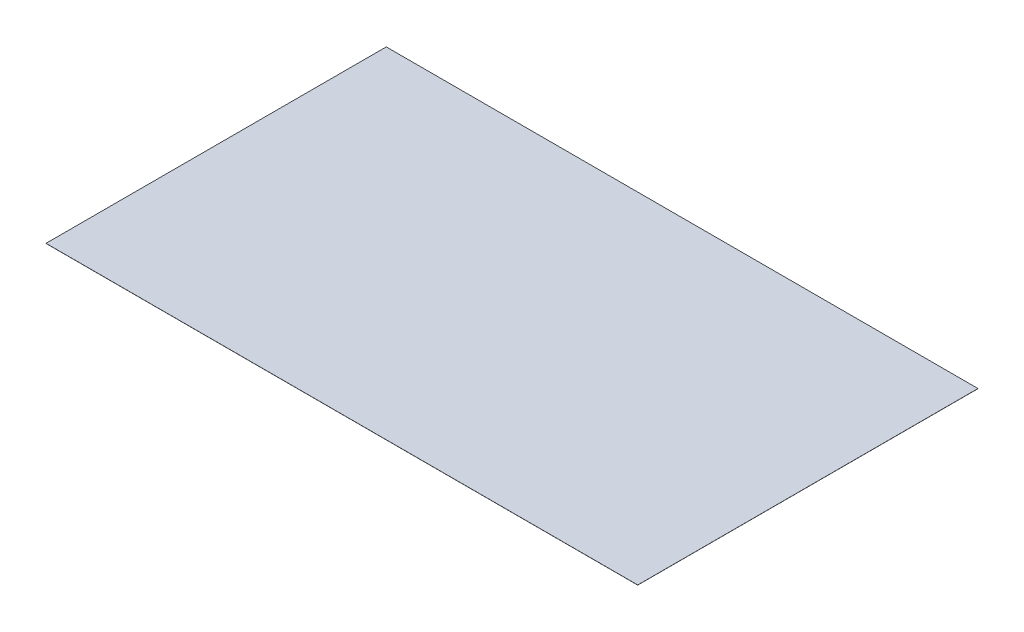
ISO-10303-21;
HEADER;
FILE_DESCRIPTION(('STEP AP214'),'2;1');
FILE_NAME('part.step','',(''),(''),'','','');
FILE_SCHEMA(('AUTOMOTIVE_DESIGN { 1 0 10303 214 1 1 1 1 }'));
ENDSEC;
DATA;
#1=APPLICATION_CONTEXT('core data for automotive mechanical design processes');
#2=APPLICATION_PROTOCOL_DEFINITION('international standard','automotive_design',2000,#1);
#3=PRODUCT_CONTEXT('',#1,'mechanical');
#4=PRODUCT('Part','Part','',(#3));
#5=PRODUCT_RELATED_PRODUCT_CATEGORY('part','',(#4));
#6=PRODUCT_DEFINITION_FORMATION('','',#4);
#7=PRODUCT_DEFINITION_CONTEXT('part definition',#1,'design');
#8=PRODUCT_DEFINITION('design','',#6,#7);
#9=PRODUCT_DEFINITION_SHAPE('','',#8);
#10=(LENGTH_UNIT() NAMED_UNIT(*) SI_UNIT(.MILLI.,.METRE.));
#11=(NAMED_UNIT(*) PLANE_ANGLE_UNIT() SI_UNIT($,.RADIAN.));
#12=(NAMED_UNIT(*) SI_UNIT($,.STERADIAN.) SOLID_ANGLE_UNIT());
#13=UNCERTAINTY_MEASURE_WITH_UNIT(LENGTH_MEASURE(1.E-05),#10,'distance_accuracy_value','');
#14=(GEOMETRIC_REPRESENTATION_CONTEXT(3) GLOBAL_UNCERTAINTY_ASSIGNED_CONTEXT((#13)) GLOBAL_UNIT_ASSIGNED_CONTEXT((#10,
#11,#12)) REPRESENTATION_CONTEXT('',''));
#15=CARTESIAN_POINT('',(0.,0.,0.));
#16=DIRECTION('',(0.,0.,1.));
#17=DIRECTION('',(1.,0.,0.));
#18=AXIS2_PLACEMENT_3D('',#15,#16,#17);
#19=CARTESIAN_POINT('',(-6096.,2.54,3505.2));
#20=DIRECTION('',(1.,0.,0.));
#21=DIRECTION('',(0.,0.,-1.));
#22=AXIS2_PLACEMENT_3D('',#19,#20,#21);
#23=PLANE('',#22);
#24=DIRECTION('',(0.,0.,1.));
#25=VECTOR('',#24,1.);
#26=CARTESIAN_POINT('',(-6096.,0.,3505.2));
#27=LINE('',#26,#25);
#28=CARTESIAN_POINT('',(-6096.,0.,-3505.2));
#29=VERTEX_POINT('',#28);
#30=CARTESIAN_POINT('',(-6096.,0.,3505.2));
#31=VERTEX_POINT('',#30);
#32=EDGE_CURVE('E96',#29,#31,#27,.T.);
#33=ORIENTED_EDGE('',*,*,#32,.T.);
#34=DIRECTION('',(0.,-1.,0.));
#35=VECTOR('',#34,1.);
#36=CARTESIAN_POINT('',(-6096.,2.54,3505.2));
#37=LINE('',#36,#35);
#38=CARTESIAN_POINT('',(-6096.,2.54,3505.2));
#39=VERTEX_POINT('',#38);
#40=EDGE_CURVE('E11',#39,#31,#37,.T.);
#41=ORIENTED_EDGE('',*,*,#40,.F.);
#42=DIRECTION('',(0.,0.,1.));
#43=VECTOR('',#42,1.);
#44=CARTESIAN_POINT('',(-6096.,2.54,3505.2));
#45=LINE('',#44,#43);
#46=CARTESIAN_POINT('',(-6096.,2.54,-3505.2));
#47=VERTEX_POINT('',#46);
#48=EDGE_CURVE('E84',#47,#39,#45,.T.);
#49=ORIENTED_EDGE('',*,*,#48,.F.);
#50=DIRECTION('',(0.,-1.,0.));
#51=VECTOR('',#50,1.);
#52=CARTESIAN_POINT('',(-6096.,2.54,-3505.2));
#53=LINE('',#52,#51);
#54=EDGE_CURVE('E92',#47,#29,#53,.T.);
#55=ORIENTED_EDGE('',*,*,#54,.T.);
#56=EDGE_LOOP('',(#33,#41,#49,#55));
#57=FACE_BOUND('',#56,.T.);
#58=ADVANCED_FACE('F33',(#57),#23,.F.);
#59=CARTESIAN_POINT('',(6096.,2.54,3505.2));
#60=DIRECTION('',(0.,0.,-1.));
#61=DIRECTION('',(-1.,0.,0.));
#62=AXIS2_PLACEMENT_3D('',#59,#60,#61);
#63=PLANE('',#62);
#64=DIRECTION('',(1.,0.,0.));
#65=VECTOR('',#64,1.);
#66=CARTESIAN_POINT('',(6096.,0.,3505.2));
#67=LINE('',#66,#65);
#68=CARTESIAN_POINT('',(6096.,0.,3505.2));
#69=VERTEX_POINT('',#68);
#70=EDGE_CURVE('E88',#31,#69,#67,.T.);
#71=ORIENTED_EDGE('',*,*,#70,.T.);
#72=DIRECTION('',(0.,-1.,0.));
#73=VECTOR('',#72,1.);
#74=CARTESIAN_POINT('',(6096.,2.54,3505.2));
#75=LINE('',#74,#73);
#76=CARTESIAN_POINT('',(6096.,2.54,3505.2));
#77=VERTEX_POINT('',#76);
#78=EDGE_CURVE('E41',#77,#69,#75,.T.);
#79=ORIENTED_EDGE('',*,*,#78,.F.);
#80=DIRECTION('',(1.,0.,0.));
#81=VECTOR('',#80,1.);
#82=CARTESIAN_POINT('',(6096.,2.54,3505.2));
#83=LINE('',#82,#81);
#84=EDGE_CURVE('E79',#39,#77,#83,.T.);
#85=ORIENTED_EDGE('',*,*,#84,.F.);
#86=ORIENTED_EDGE('',*,*,#40,.T.);
#87=EDGE_LOOP('',(#71,#79,#85,#86));
#88=FACE_BOUND('',#87,.T.);
#89=ADVANCED_FACE('F87',(#88),#63,.F.);
#90=CARTESIAN_POINT('',(6096.,2.54,3505.2));
#91=DIRECTION('',(-1.,0.,0.));
#92=DIRECTION('',(0.,0.,1.));
#93=AXIS2_PLACEMENT_3D('',#90,#91,#92);
#94=PLANE('',#93);
#95=DIRECTION('',(0.,0.,-1.));
#96=VECTOR('',#95,1.);
#97=CARTESIAN_POINT('',(6096.,0.,3505.2));
#98=LINE('',#97,#96);
#99=CARTESIAN_POINT('',(6096.,0.,-3505.2));
#100=VERTEX_POINT('',#99);
#101=EDGE_CURVE('E66',#69,#100,#98,.T.);
#102=ORIENTED_EDGE('',*,*,#101,.T.);
#103=DIRECTION('',(0.,-1.,0.));
#104=VECTOR('',#103,1.);
#105=CARTESIAN_POINT('',(6096.,2.54,-3505.2));
#106=LINE('',#105,#104);
#107=CARTESIAN_POINT('',(6096.,2.54,-3505.2));
#108=VERTEX_POINT('',#107);
#109=EDGE_CURVE('E89',#108,#100,#106,.T.);
#110=ORIENTED_EDGE('',*,*,#109,.F.);
#111=DIRECTION('',(0.,0.,-1.));
#112=VECTOR('',#111,1.);
#113=CARTESIAN_POINT('',(6096.,2.54,3505.2));
#114=LINE('',#113,#112);
#115=EDGE_CURVE('E82',#77,#108,#114,.T.);
#116=ORIENTED_EDGE('',*,*,#115,.F.);
#117=ORIENTED_EDGE('',*,*,#78,.T.);
#118=EDGE_LOOP('',(#102,#110,#116,#117));
#119=FACE_BOUND('',#118,.T.);
#120=ADVANCED_FACE('F90',(#119),#94,.F.);
#121=CARTESIAN_POINT('',(6096.,2.54,-3505.2));
#122=DIRECTION('',(0.,0.,1.));
#123=DIRECTION('',(1.,0.,0.));
#124=AXIS2_PLACEMENT_3D('',#121,#122,#123);
#125=PLANE('',#124);
#126=DIRECTION('',(-1.,0.,0.));
#127=VECTOR('',#126,1.);
#128=CARTESIAN_POINT('',(6096.,0.,-3505.2));
#129=LINE('',#128,#127);
#130=EDGE_CURVE('E72',#100,#29,#129,.T.);
#131=ORIENTED_EDGE('',*,*,#130,.T.);
#132=ORIENTED_EDGE('',*,*,#54,.F.);
#133=DIRECTION('',(-1.,0.,0.));
#134=VECTOR('',#133,1.);
#135=CARTESIAN_POINT('',(6096.,2.54,-3505.2));
#136=LINE('',#135,#134);
#137=EDGE_CURVE('E49',#108,#47,#136,.T.);
#138=ORIENTED_EDGE('',*,*,#137,.F.);
#139=ORIENTED_EDGE('',*,*,#109,.T.);
#140=EDGE_LOOP('',(#131,#132,#138,#139));
#141=FACE_BOUND('',#140,.T.);
#142=ADVANCED_FACE('F103',(#141),#125,.F.);
#143=CARTESIAN_POINT('',(0.,2.54,0.));
#144=DIRECTION('',(0.,1.,0.));
#145=DIRECTION('',(0.,0.,1.));
#146=AXIS2_PLACEMENT_3D('',#143,#144,#145);
#147=PLANE('',#146);
#148=ORIENTED_EDGE('',*,*,#48,.T.);
#149=ORIENTED_EDGE('',*,*,#84,.T.);
#150=ORIENTED_EDGE('',*,*,#115,.T.);
#151=ORIENTED_EDGE('',*,*,#137,.T.);
#152=EDGE_LOOP('',(#148,#149,#150,#151));
#153=FACE_BOUND('',#152,.T.);
#154=ADVANCED_FACE('F80',(#153),#147,.T.);
#155=CARTESIAN_POINT('',(0.,0.,0.));
#156=DIRECTION('',(0.,1.,0.));
#157=DIRECTION('',(0.,0.,1.));
#158=AXIS2_PLACEMENT_3D('',#155,#156,#157);
#159=PLANE('',#158);
#160=ORIENTED_EDGE('',*,*,#32,.F.);
#161=ORIENTED_EDGE('',*,*,#130,.F.);
#162=ORIENTED_EDGE('',*,*,#101,.F.);
#163=ORIENTED_EDGE('',*,*,#70,.F.);
#164=EDGE_LOOP('',(#160,#161,#162,#163));
#165=FACE_BOUND('',#164,.T.);
#166=ADVANCED_FACE('F106',(#165),#159,.F.);
#167=CLOSED_SHELL('',(#58,#89,#120,#142,#154,#166));
#168=MANIFOLD_SOLID_BREP('B2',#167);
#169=ADVANCED_BREP_SHAPE_REPRESENTATION('',(#18,#168),#14);
#170=SHAPE_DEFINITION_REPRESENTATION(#9,#169);
ENDSEC;
END-ISO-10303-21;
